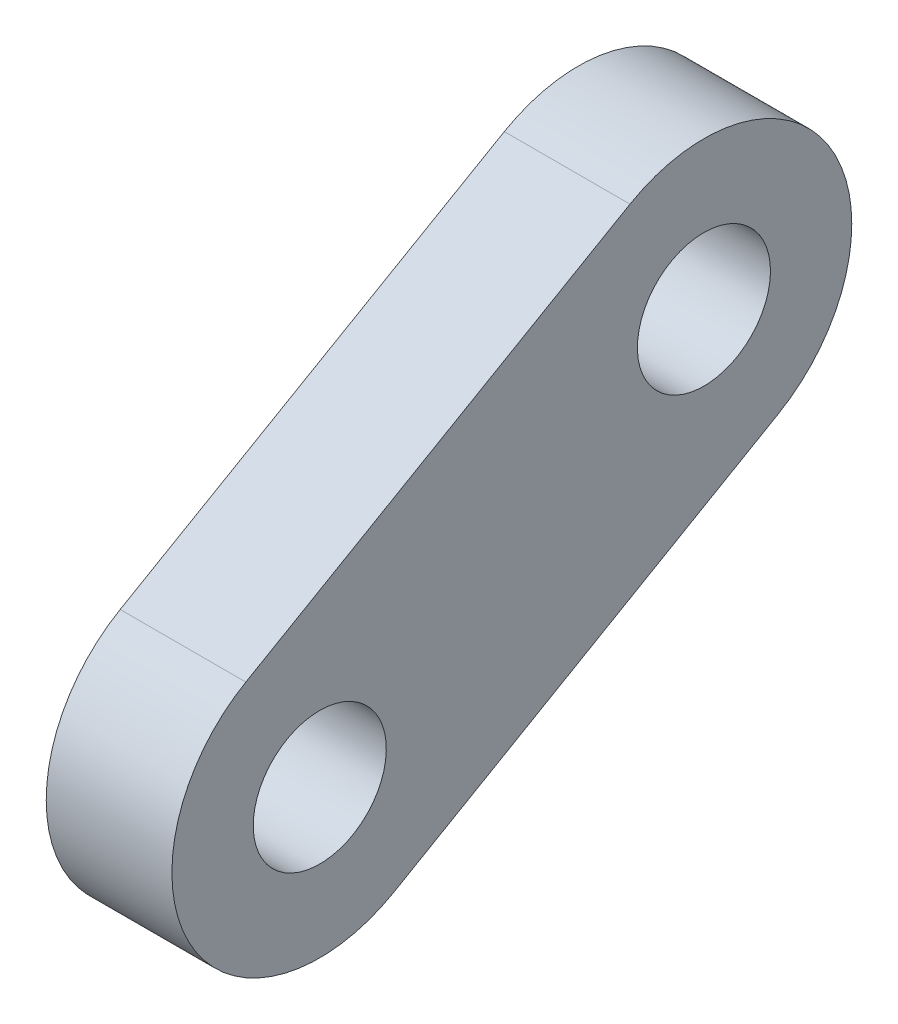
ISO-10303-21;
HEADER;
FILE_DESCRIPTION(('STEP AP214'),'2;1');
FILE_NAME('part.step','',(''),(''),'','','');
FILE_SCHEMA(('AUTOMOTIVE_DESIGN { 1 0 10303 214 1 1 1 1 }'));
ENDSEC;
DATA;
#1=APPLICATION_CONTEXT('core data for automotive mechanical design processes');
#2=APPLICATION_PROTOCOL_DEFINITION('international standard','automotive_design',2000,#1);
#3=PRODUCT_CONTEXT('',#1,'mechanical');
#4=PRODUCT('Part','Part','',(#3));
#5=PRODUCT_RELATED_PRODUCT_CATEGORY('part','',(#4));
#6=PRODUCT_DEFINITION_FORMATION('','',#4);
#7=PRODUCT_DEFINITION_CONTEXT('part definition',#1,'design');
#8=PRODUCT_DEFINITION('design','',#6,#7);
#9=PRODUCT_DEFINITION_SHAPE('','',#8);
#10=(LENGTH_UNIT() NAMED_UNIT(*) SI_UNIT(.MILLI.,.METRE.));
#11=(NAMED_UNIT(*) PLANE_ANGLE_UNIT() SI_UNIT($,.RADIAN.));
#12=(NAMED_UNIT(*) SI_UNIT($,.STERADIAN.) SOLID_ANGLE_UNIT());
#13=UNCERTAINTY_MEASURE_WITH_UNIT(LENGTH_MEASURE(1.E-05),#10,'distance_accuracy_value','');
#14=(GEOMETRIC_REPRESENTATION_CONTEXT(3) GLOBAL_UNCERTAINTY_ASSIGNED_CONTEXT((#13)) GLOBAL_UNIT_ASSIGNED_CONTEXT((#10,
#11,#12)) REPRESENTATION_CONTEXT('',''));
#15=CARTESIAN_POINT('',(0.,0.,0.));
#16=DIRECTION('',(0.,0.,1.));
#17=DIRECTION('',(1.,0.,0.));
#18=AXIS2_PLACEMENT_3D('',#15,#16,#17);
#19=CARTESIAN_POINT('',(4.15,9.53589838486225,3.19615242270663));
#20=DIRECTION('',(0.,-0.866025403784439,-0.5));
#21=DIRECTION('',(0.,0.5,-0.866025403784439));
#22=AXIS2_PLACEMENT_3D('',#19,#20,#21);
#23=PLANE('',#22);
#24=DIRECTION('',(0.,-0.5,0.866025403784439));
#25=VECTOR('',#24,1.);
#26=CARTESIAN_POINT('',(0.75,9.53589838486225,3.19615242270663));
#27=LINE('',#26,#25);
#28=CARTESIAN_POINT('',(0.75,12.5358983848622,-2.));
#29=VERTEX_POINT('',#28);
#30=CARTESIAN_POINT('',(0.75,6.53589838486225,8.39230484541326));
#31=VERTEX_POINT('',#30);
#32=EDGE_CURVE('E10',#29,#31,#27,.T.);
#33=ORIENTED_EDGE('',*,*,#32,.F.);
#34=DIRECTION('',(-1.,0.,0.));
#35=VECTOR('',#34,1.);
#36=CARTESIAN_POINT('',(4.15,12.5358983848622,-2.));
#37=LINE('',#36,#35);
#38=CARTESIAN_POINT('',(4.15,12.5358983848622,-2.));
#39=VERTEX_POINT('',#38);
#40=EDGE_CURVE('E23',#39,#29,#37,.T.);
#41=ORIENTED_EDGE('',*,*,#40,.F.);
#42=DIRECTION('',(0.,-0.5,0.866025403784439));
#43=VECTOR('',#42,1.);
#44=CARTESIAN_POINT('',(4.15,9.53589838486225,3.19615242270663));
#45=LINE('',#44,#43);
#46=CARTESIAN_POINT('',(4.15,6.53589838486225,8.39230484541326));
#47=VERTEX_POINT('',#46);
#48=EDGE_CURVE('E87',#39,#47,#45,.T.);
#49=ORIENTED_EDGE('',*,*,#48,.T.);
#50=DIRECTION('',(-1.,0.,0.));
#51=VECTOR('',#50,1.);
#52=CARTESIAN_POINT('',(4.15,6.53589838486225,8.39230484541326));
#53=LINE('',#52,#51);
#54=EDGE_CURVE('E68',#47,#31,#53,.T.);
#55=ORIENTED_EDGE('',*,*,#54,.T.);
#56=EDGE_LOOP('',(#33,#41,#49,#55));
#57=FACE_BOUND('',#56,.T.);
#58=ADVANCED_FACE('F16',(#57),#23,.T.);
#59=CARTESIAN_POINT('',(4.15,16.,0.));
#60=DIRECTION('',(-1.,0.,0.));
#61=DIRECTION('',(0.,1.,0.));
#62=AXIS2_PLACEMENT_3D('',#59,#60,#61);
#63=CYLINDRICAL_SURFACE('',#62,4.);
#64=CARTESIAN_POINT('',(0.75,16.,0.));
#65=DIRECTION('',(-1.,0.,0.));
#66=DIRECTION('',(0.,-1.,0.));
#67=AXIS2_PLACEMENT_3D('',#64,#65,#66);
#68=CIRCLE('',#67,4.);
#69=CARTESIAN_POINT('',(0.75,19.4641016151377,2.));
#70=VERTEX_POINT('',#69);
#71=EDGE_CURVE('E83',#70,#29,#68,.T.);
#72=ORIENTED_EDGE('',*,*,#71,.F.);
#73=DIRECTION('',(-1.,0.,0.));
#74=VECTOR('',#73,1.);
#75=CARTESIAN_POINT('',(4.15,19.4641016151377,2.));
#76=LINE('',#75,#74);
#77=CARTESIAN_POINT('',(4.15,19.4641016151377,2.));
#78=VERTEX_POINT('',#77);
#79=EDGE_CURVE('E81',#78,#70,#76,.T.);
#80=ORIENTED_EDGE('',*,*,#79,.F.);
#81=CARTESIAN_POINT('',(4.15,16.,0.));
#82=DIRECTION('',(-1.,0.,0.));
#83=DIRECTION('',(0.,-1.,0.));
#84=AXIS2_PLACEMENT_3D('',#81,#82,#83);
#85=CIRCLE('',#84,4.);
#86=EDGE_CURVE('E75',#78,#39,#85,.T.);
#87=ORIENTED_EDGE('',*,*,#86,.T.);
#88=ORIENTED_EDGE('',*,*,#40,.T.);
#89=EDGE_LOOP('',(#72,#80,#87,#88));
#90=FACE_BOUND('',#89,.T.);
#91=ADVANCED_FACE('F89',(#90),#63,.T.);
#92=CARTESIAN_POINT('',(4.15,16.4641016151377,7.19615242270663));
#93=DIRECTION('',(0.,-0.866025403784439,-0.5));
#94=DIRECTION('',(0.,0.5,-0.866025403784439));
#95=AXIS2_PLACEMENT_3D('',#92,#93,#94);
#96=PLANE('',#95);
#97=DIRECTION('',(0.,-0.5,0.866025403784439));
#98=VECTOR('',#97,1.);
#99=CARTESIAN_POINT('',(0.75,16.4641016151377,7.19615242270663));
#100=LINE('',#99,#98);
#101=CARTESIAN_POINT('',(0.75,13.4641016151378,12.3923048454133));
#102=VERTEX_POINT('',#101);
#103=EDGE_CURVE('E59',#70,#102,#100,.T.);
#104=ORIENTED_EDGE('',*,*,#103,.T.);
#105=DIRECTION('',(-1.,0.,0.));
#106=VECTOR('',#105,1.);
#107=CARTESIAN_POINT('',(4.15,13.4641016151378,12.3923048454133));
#108=LINE('',#107,#106);
#109=CARTESIAN_POINT('',(4.15,13.4641016151378,12.3923048454133));
#110=VERTEX_POINT('',#109);
#111=EDGE_CURVE('E51',#110,#102,#108,.T.);
#112=ORIENTED_EDGE('',*,*,#111,.F.);
#113=DIRECTION('',(0.,-0.5,0.866025403784439));
#114=VECTOR('',#113,1.);
#115=CARTESIAN_POINT('',(4.15,16.4641016151377,7.19615242270663));
#116=LINE('',#115,#114);
#117=EDGE_CURVE('E56',#78,#110,#116,.T.);
#118=ORIENTED_EDGE('',*,*,#117,.F.);
#119=ORIENTED_EDGE('',*,*,#79,.T.);
#120=EDGE_LOOP('',(#104,#112,#118,#119));
#121=FACE_BOUND('',#120,.T.);
#122=ADVANCED_FACE('F53',(#121),#96,.F.);
#123=CARTESIAN_POINT('',(4.15,10.,10.3923048454133));
#124=DIRECTION('',(-1.,0.,0.));
#125=DIRECTION('',(0.,1.,0.));
#126=AXIS2_PLACEMENT_3D('',#123,#124,#125);
#127=CYLINDRICAL_SURFACE('',#126,4.);
#128=CARTESIAN_POINT('',(0.75,10.,10.3923048454133));
#129=DIRECTION('',(-1.,0.,0.));
#130=DIRECTION('',(0.,-1.,0.));
#131=AXIS2_PLACEMENT_3D('',#128,#129,#130);
#132=CIRCLE('',#131,4.);
#133=EDGE_CURVE('E71',#31,#102,#132,.T.);
#134=ORIENTED_EDGE('',*,*,#133,.F.);
#135=ORIENTED_EDGE('',*,*,#54,.F.);
#136=CARTESIAN_POINT('',(4.15,10.,10.3923048454133));
#137=DIRECTION('',(-1.,0.,0.));
#138=DIRECTION('',(0.,-1.,0.));
#139=AXIS2_PLACEMENT_3D('',#136,#137,#138);
#140=CIRCLE('',#139,4.);
#141=EDGE_CURVE('E66',#47,#110,#140,.T.);
#142=ORIENTED_EDGE('',*,*,#141,.T.);
#143=ORIENTED_EDGE('',*,*,#111,.T.);
#144=EDGE_LOOP('',(#134,#135,#142,#143));
#145=FACE_BOUND('',#144,.T.);
#146=ADVANCED_FACE('F67',(#145),#127,.T.);
#147=CARTESIAN_POINT('',(4.15,5.,2.24428235379889));
#148=DIRECTION('',(1.,0.,0.));
#149=DIRECTION('',(0.,0.,-1.));
#150=AXIS2_PLACEMENT_3D('',#147,#148,#149);
#151=PLANE('',#150);
#152=CARTESIAN_POINT('',(4.15,16.,0.));
#153=DIRECTION('',(-1.,0.,0.));
#154=DIRECTION('',(0.,1.,0.));
#155=AXIS2_PLACEMENT_3D('',#152,#153,#154);
#156=CIRCLE('',#155,1.8);
#157=CARTESIAN_POINT('',(4.15,17.8,0.));
#158=VERTEX_POINT('',#157);
#159=EDGE_CURVE('E72',#158,#158,#156,.T.);
#160=ORIENTED_EDGE('',*,*,#159,.T.);
#161=EDGE_LOOP('',(#160));
#162=FACE_BOUND('',#161,.T.);
#163=CARTESIAN_POINT('',(4.15,10.,10.3923048454133));
#164=DIRECTION('',(-1.,0.,0.));
#165=DIRECTION('',(0.,1.,0.));
#166=AXIS2_PLACEMENT_3D('',#163,#164,#165);
#167=CIRCLE('',#166,1.8);
#168=CARTESIAN_POINT('',(4.15,11.8,10.3923048454133));
#169=VERTEX_POINT('',#168);
#170=EDGE_CURVE('E163',#169,#169,#167,.T.);
#171=ORIENTED_EDGE('',*,*,#170,.T.);
#172=EDGE_LOOP('',(#171));
#173=FACE_BOUND('',#172,.T.);
#174=ORIENTED_EDGE('',*,*,#48,.F.);
#175=ORIENTED_EDGE('',*,*,#86,.F.);
#176=ORIENTED_EDGE('',*,*,#117,.T.);
#177=ORIENTED_EDGE('',*,*,#141,.F.);
#178=EDGE_LOOP('',(#174,#175,#176,#177));
#179=FACE_BOUND('',#178,.T.);
#180=ADVANCED_FACE('F74',(#162,#173,#179),#151,.T.);
#181=CARTESIAN_POINT('',(0.75,5.,2.24428235379889));
#182=DIRECTION('',(1.,0.,0.));
#183=DIRECTION('',(0.,0.,-1.));
#184=AXIS2_PLACEMENT_3D('',#181,#182,#183);
#185=PLANE('',#184);
#186=CARTESIAN_POINT('',(0.75,16.,0.));
#187=DIRECTION('',(1.,0.,0.));
#188=DIRECTION('',(0.,-1.,0.));
#189=AXIS2_PLACEMENT_3D('',#186,#187,#188);
#190=CIRCLE('',#189,1.8);
#191=CARTESIAN_POINT('',(0.75,14.2,0.));
#192=VERTEX_POINT('',#191);
#193=EDGE_CURVE('E162',#192,#192,#190,.F.);
#194=ORIENTED_EDGE('',*,*,#193,.F.);
#195=EDGE_LOOP('',(#194));
#196=FACE_BOUND('',#195,.T.);
#197=CARTESIAN_POINT('',(0.75,10.,10.3923048454133));
#198=DIRECTION('',(1.,0.,0.));
#199=DIRECTION('',(0.,-1.,0.));
#200=AXIS2_PLACEMENT_3D('',#197,#198,#199);
#201=CIRCLE('',#200,1.8);
#202=CARTESIAN_POINT('',(0.75,8.2,10.3923048454133));
#203=VERTEX_POINT('',#202);
#204=EDGE_CURVE('E164',#203,#203,#201,.F.);
#205=ORIENTED_EDGE('',*,*,#204,.F.);
#206=EDGE_LOOP('',(#205));
#207=FACE_BOUND('',#206,.T.);
#208=ORIENTED_EDGE('',*,*,#32,.T.);
#209=ORIENTED_EDGE('',*,*,#133,.T.);
#210=ORIENTED_EDGE('',*,*,#103,.F.);
#211=ORIENTED_EDGE('',*,*,#71,.T.);
#212=EDGE_LOOP('',(#208,#209,#210,#211));
#213=FACE_BOUND('',#212,.T.);
#214=ADVANCED_FACE('F91',(#196,#207,#213),#185,.F.);
#215=CARTESIAN_POINT('',(4.15,10.,10.3923048454133));
#216=DIRECTION('',(-1.,0.,0.));
#217=DIRECTION('',(0.,1.,0.));
#218=AXIS2_PLACEMENT_3D('',#215,#216,#217);
#219=CYLINDRICAL_SURFACE('',#218,1.8);
#220=ORIENTED_EDGE('',*,*,#170,.F.);
#221=EDGE_LOOP('',(#220));
#222=FACE_BOUND('',#221,.T.);
#223=ORIENTED_EDGE('',*,*,#204,.T.);
#224=EDGE_LOOP('',(#223));
#225=FACE_BOUND('',#224,.T.);
#226=ADVANCED_FACE('F93',(#222,#225),#219,.F.);
#227=CARTESIAN_POINT('',(4.15,16.,0.));
#228=DIRECTION('',(-1.,0.,0.));
#229=DIRECTION('',(0.,1.,0.));
#230=AXIS2_PLACEMENT_3D('',#227,#228,#229);
#231=CYLINDRICAL_SURFACE('',#230,1.8);
#232=ORIENTED_EDGE('',*,*,#159,.F.);
#233=EDGE_LOOP('',(#232));
#234=FACE_BOUND('',#233,.T.);
#235=ORIENTED_EDGE('',*,*,#193,.T.);
#236=EDGE_LOOP('',(#235));
#237=FACE_BOUND('',#236,.T.);
#238=ADVANCED_FACE('F101',(#234,#237),#231,.F.);
#239=CLOSED_SHELL('',(#58,#91,#122,#146,#180,#214,#226,#238));
#240=MANIFOLD_SOLID_BREP('B1',#239);
#241=ADVANCED_BREP_SHAPE_REPRESENTATION('',(#18,#240),#14);
#242=SHAPE_DEFINITION_REPRESENTATION(#9,#241);
ENDSEC;
END-ISO-10303-21;
